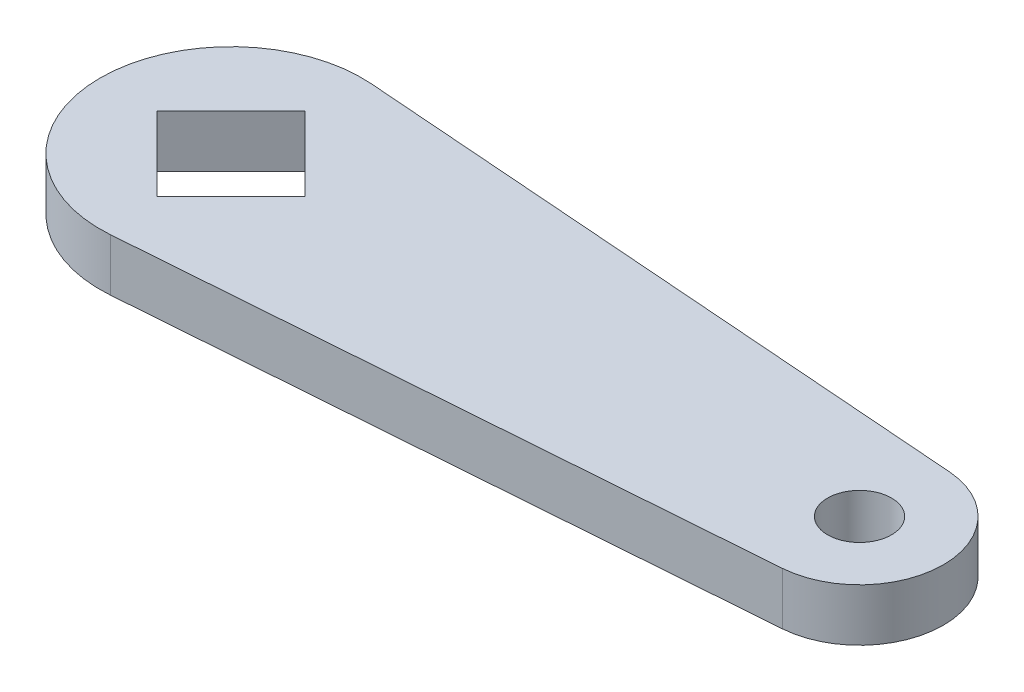
ISO-10303-21;
HEADER;
FILE_DESCRIPTION(('STEP AP214'),'2;1');
FILE_NAME('part.step','',(''),(''),'','','');
FILE_SCHEMA(('AUTOMOTIVE_DESIGN { 1 0 10303 214 1 1 1 1 }'));
ENDSEC;
DATA;
#1=APPLICATION_CONTEXT('core data for automotive mechanical design processes');
#2=APPLICATION_PROTOCOL_DEFINITION('international standard','automotive_design',2000,#1);
#3=PRODUCT_CONTEXT('',#1,'mechanical');
#4=PRODUCT('Part','Part','',(#3));
#5=PRODUCT_RELATED_PRODUCT_CATEGORY('part','',(#4));
#6=PRODUCT_DEFINITION_FORMATION('','',#4);
#7=PRODUCT_DEFINITION_CONTEXT('part definition',#1,'design');
#8=PRODUCT_DEFINITION('design','',#6,#7);
#9=PRODUCT_DEFINITION_SHAPE('','',#8);
#10=(LENGTH_UNIT() NAMED_UNIT(*) SI_UNIT(.MILLI.,.METRE.));
#11=(NAMED_UNIT(*) PLANE_ANGLE_UNIT() SI_UNIT($,.RADIAN.));
#12=(NAMED_UNIT(*) SI_UNIT($,.STERADIAN.) SOLID_ANGLE_UNIT());
#13=UNCERTAINTY_MEASURE_WITH_UNIT(LENGTH_MEASURE(1.E-05),#10,'distance_accuracy_value','');
#14=(GEOMETRIC_REPRESENTATION_CONTEXT(3) GLOBAL_UNCERTAINTY_ASSIGNED_CONTEXT((#13)) GLOBAL_UNIT_ASSIGNED_CONTEXT((#10,
#11,#12)) REPRESENTATION_CONTEXT('',''));
#15=CARTESIAN_POINT('',(0.,0.,0.));
#16=DIRECTION('',(0.,0.,1.));
#17=DIRECTION('',(1.,0.,0.));
#18=AXIS2_PLACEMENT_3D('',#15,#16,#17);
#19=CARTESIAN_POINT('',(3.53553390593274,5.,3.53553390593274));
#20=DIRECTION('',(-0.707106781186547,0.,-0.707106781186548));
#21=DIRECTION('',(-0.707106781186548,0.,0.707106781186547));
#22=AXIS2_PLACEMENT_3D('',#19,#20,#21);
#23=PLANE('',#22);
#24=DIRECTION('',(0.707106781186548,0.,-0.707106781186547));
#25=VECTOR('',#24,1.);
#26=CARTESIAN_POINT('',(3.53553390593274,0.,3.53553390593274));
#27=LINE('',#26,#25);
#28=CARTESIAN_POINT('',(0.,0.,7.07106781186547));
#29=VERTEX_POINT('',#28);
#30=CARTESIAN_POINT('',(7.07106781186548,0.,0.));
#31=VERTEX_POINT('',#30);
#32=EDGE_CURVE('E157',#29,#31,#27,.T.);
#33=ORIENTED_EDGE('',*,*,#32,.F.);
#34=DIRECTION('',(0.,-1.,0.));
#35=VECTOR('',#34,1.);
#36=CARTESIAN_POINT('',(0.,5.,7.07106781186547));
#37=LINE('',#36,#35);
#38=CARTESIAN_POINT('',(0.,5.,7.07106781186547));
#39=VERTEX_POINT('',#38);
#40=EDGE_CURVE('E11',#39,#29,#37,.T.);
#41=ORIENTED_EDGE('',*,*,#40,.F.);
#42=DIRECTION('',(0.707106781186548,0.,-0.707106781186547));
#43=VECTOR('',#42,1.);
#44=CARTESIAN_POINT('',(3.53553390593274,5.,3.53553390593274));
#45=LINE('',#44,#43);
#46=CARTESIAN_POINT('',(7.07106781186548,5.,0.));
#47=VERTEX_POINT('',#46);
#48=EDGE_CURVE('E135',#39,#47,#45,.T.);
#49=ORIENTED_EDGE('',*,*,#48,.T.);
#50=DIRECTION('',(0.,-1.,0.));
#51=VECTOR('',#50,1.);
#52=CARTESIAN_POINT('',(7.07106781186548,5.,0.));
#53=LINE('',#52,#51);
#54=EDGE_CURVE('E95',#47,#31,#53,.T.);
#55=ORIENTED_EDGE('',*,*,#54,.T.);
#56=EDGE_LOOP('',(#33,#41,#49,#55));
#57=FACE_BOUND('',#56,.T.);
#58=ADVANCED_FACE('F41',(#57),#23,.T.);
#59=CARTESIAN_POINT('',(-3.53553390593273,5.,3.53553390593273));
#60=DIRECTION('',(0.707106781186548,0.,-0.707106781186548));
#61=DIRECTION('',(-0.707106781186548,0.,-0.707106781186548));
#62=AXIS2_PLACEMENT_3D('',#59,#60,#61);
#63=PLANE('',#62);
#64=DIRECTION('',(0.707106781186548,0.,0.707106781186548));
#65=VECTOR('',#64,1.);
#66=CARTESIAN_POINT('',(-3.53553390593273,0.,3.53553390593273));
#67=LINE('',#66,#65);
#68=CARTESIAN_POINT('',(-7.07106781186547,0.,0.));
#69=VERTEX_POINT('',#68);
#70=EDGE_CURVE('E124',#69,#29,#67,.T.);
#71=ORIENTED_EDGE('',*,*,#70,.F.);
#72=DIRECTION('',(0.,-1.,0.));
#73=VECTOR('',#72,1.);
#74=CARTESIAN_POINT('',(-7.07106781186547,5.,0.));
#75=LINE('',#74,#73);
#76=CARTESIAN_POINT('',(-7.07106781186547,5.,0.));
#77=VERTEX_POINT('',#76);
#78=EDGE_CURVE('E51',#77,#69,#75,.T.);
#79=ORIENTED_EDGE('',*,*,#78,.F.);
#80=DIRECTION('',(0.707106781186548,0.,0.707106781186548));
#81=VECTOR('',#80,1.);
#82=CARTESIAN_POINT('',(-3.53553390593273,5.,3.53553390593273));
#83=LINE('',#82,#81);
#84=EDGE_CURVE('E122',#77,#39,#83,.T.);
#85=ORIENTED_EDGE('',*,*,#84,.T.);
#86=ORIENTED_EDGE('',*,*,#40,.T.);
#87=EDGE_LOOP('',(#71,#79,#85,#86));
#88=FACE_BOUND('',#87,.T.);
#89=ADVANCED_FACE('F120',(#88),#63,.T.);
#90=CARTESIAN_POINT('',(-3.53553390593274,5.,-3.53553390593274));
#91=DIRECTION('',(-0.707106781186547,0.,-0.707106781186548));
#92=DIRECTION('',(-0.707106781186548,0.,0.707106781186547));
#93=AXIS2_PLACEMENT_3D('',#90,#91,#92);
#94=PLANE('',#93);
#95=DIRECTION('',(0.707106781186548,0.,-0.707106781186547));
#96=VECTOR('',#95,1.);
#97=CARTESIAN_POINT('',(-3.53553390593274,0.,-3.53553390593274));
#98=LINE('',#97,#96);
#99=CARTESIAN_POINT('',(0.,0.,-7.07106781186548));
#100=VERTEX_POINT('',#99);
#101=EDGE_CURVE('E160',#69,#100,#98,.T.);
#102=ORIENTED_EDGE('',*,*,#101,.T.);
#103=DIRECTION('',(0.,-1.,0.));
#104=VECTOR('',#103,1.);
#105=CARTESIAN_POINT('',(0.,5.,-7.07106781186548));
#106=LINE('',#105,#104);
#107=CARTESIAN_POINT('',(0.,5.,-7.07106781186548));
#108=VERTEX_POINT('',#107);
#109=EDGE_CURVE('E127',#108,#100,#106,.T.);
#110=ORIENTED_EDGE('',*,*,#109,.F.);
#111=DIRECTION('',(0.707106781186548,0.,-0.707106781186547));
#112=VECTOR('',#111,1.);
#113=CARTESIAN_POINT('',(-3.53553390593274,5.,-3.53553390593274));
#114=LINE('',#113,#112);
#115=EDGE_CURVE('E130',#77,#108,#114,.T.);
#116=ORIENTED_EDGE('',*,*,#115,.F.);
#117=ORIENTED_EDGE('',*,*,#78,.T.);
#118=EDGE_LOOP('',(#102,#110,#116,#117));
#119=FACE_BOUND('',#118,.T.);
#120=ADVANCED_FACE('F131',(#119),#94,.F.);
#121=CARTESIAN_POINT('',(0.9375,5.,12.464794171987));
#122=DIRECTION('',(-0.075,0.,-0.997183533758957));
#123=DIRECTION('',(-0.997183533758957,0.,0.075));
#124=AXIS2_PLACEMENT_3D('',#121,#122,#123);
#125=PLANE('',#124);
#126=DIRECTION('',(0.997183533758957,0.,-0.075));
#127=VECTOR('',#126,1.);
#128=CARTESIAN_POINT('',(0.9375,0.,12.464794171987));
#129=LINE('',#128,#127);
#130=CARTESIAN_POINT('',(0.937500000000001,0.,12.464794171987));
#131=VERTEX_POINT('',#130);
#132=CARTESIAN_POINT('',(60.6,0.,7.97746827007165));
#133=VERTEX_POINT('',#132);
#134=EDGE_CURVE('E146',#131,#133,#129,.T.);
#135=ORIENTED_EDGE('',*,*,#134,.T.);
#136=DIRECTION('',(0.,-1.,0.));
#137=VECTOR('',#136,1.);
#138=CARTESIAN_POINT('',(60.6,5.,7.97746827007165));
#139=LINE('',#138,#137);
#140=CARTESIAN_POINT('',(60.6,5.,7.97746827007165));
#141=VERTEX_POINT('',#140);
#142=EDGE_CURVE('E45',#141,#133,#139,.T.);
#143=ORIENTED_EDGE('',*,*,#142,.F.);
#144=DIRECTION('',(0.997183533758957,0.,-0.075));
#145=VECTOR('',#144,1.);
#146=CARTESIAN_POINT('',(0.9375,5.,12.464794171987));
#147=LINE('',#146,#145);
#148=CARTESIAN_POINT('',(0.937500000000001,5.,12.464794171987));
#149=VERTEX_POINT('',#148);
#150=EDGE_CURVE('E166',#149,#141,#147,.T.);
#151=ORIENTED_EDGE('',*,*,#150,.F.);
#152=DIRECTION('',(0.,-1.,0.));
#153=VECTOR('',#152,1.);
#154=CARTESIAN_POINT('',(0.937500000000001,5.,12.464794171987));
#155=LINE('',#154,#153);
#156=EDGE_CURVE('E145',#149,#131,#155,.T.);
#157=ORIENTED_EDGE('',*,*,#156,.T.);
#158=EDGE_LOOP('',(#135,#143,#151,#157));
#159=FACE_BOUND('',#158,.T.);
#160=ADVANCED_FACE('F43',(#159),#125,.F.);
#161=CARTESIAN_POINT('',(60.,5.,0.));
#162=DIRECTION('',(0.,-1.,0.));
#163=DIRECTION('',(0.,0.,-1.));
#164=AXIS2_PLACEMENT_3D('',#161,#162,#163);
#165=CYLINDRICAL_SURFACE('',#164,8.);
#166=CARTESIAN_POINT('',(60.,0.,0.));
#167=DIRECTION('',(0.,1.,0.));
#168=DIRECTION('',(0.,0.,1.));
#169=AXIS2_PLACEMENT_3D('',#166,#167,#168);
#170=CIRCLE('',#169,8.);
#171=CARTESIAN_POINT('',(60.6,0.,-7.97746827007165));
#172=VERTEX_POINT('',#171);
#173=EDGE_CURVE('E149',#133,#172,#170,.T.);
#174=ORIENTED_EDGE('',*,*,#173,.T.);
#175=DIRECTION('',(0.,-1.,0.));
#176=VECTOR('',#175,1.);
#177=CARTESIAN_POINT('',(60.6,5.,-7.97746827007165));
#178=LINE('',#177,#176);
#179=CARTESIAN_POINT('',(60.6,5.,-7.97746827007165));
#180=VERTEX_POINT('',#179);
#181=EDGE_CURVE('E172',#180,#172,#178,.T.);
#182=ORIENTED_EDGE('',*,*,#181,.F.);
#183=CARTESIAN_POINT('',(60.,5.,0.));
#184=DIRECTION('',(0.,1.,0.));
#185=DIRECTION('',(0.,0.,1.));
#186=AXIS2_PLACEMENT_3D('',#183,#184,#185);
#187=CIRCLE('',#186,8.);
#188=EDGE_CURVE('E103',#141,#180,#187,.T.);
#189=ORIENTED_EDGE('',*,*,#188,.F.);
#190=ORIENTED_EDGE('',*,*,#142,.T.);
#191=EDGE_LOOP('',(#174,#182,#189,#190));
#192=FACE_BOUND('',#191,.T.);
#193=ADVANCED_FACE('F177',(#192),#165,.T.);
#194=CARTESIAN_POINT('',(0.937500000000002,5.,-12.464794171987));
#195=DIRECTION('',(0.0750000000000001,0.,-0.997183533758957));
#196=DIRECTION('',(-0.997183533758957,0.,-0.0750000000000001));
#197=AXIS2_PLACEMENT_3D('',#194,#195,#196);
#198=PLANE('',#197);
#199=DIRECTION('',(0.997183533758957,0.,0.0750000000000001));
#200=VECTOR('',#199,1.);
#201=CARTESIAN_POINT('',(0.937500000000002,0.,-12.464794171987));
#202=LINE('',#201,#200);
#203=CARTESIAN_POINT('',(0.937500000000001,0.,-12.464794171987));
#204=VERTEX_POINT('',#203);
#205=EDGE_CURVE('E152',#204,#172,#202,.T.);
#206=ORIENTED_EDGE('',*,*,#205,.F.);
#207=DIRECTION('',(0.,-1.,0.));
#208=VECTOR('',#207,1.);
#209=CARTESIAN_POINT('',(0.937500000000001,5.,-12.464794171987));
#210=LINE('',#209,#208);
#211=CARTESIAN_POINT('',(0.937500000000001,5.,-12.464794171987));
#212=VERTEX_POINT('',#211);
#213=EDGE_CURVE('E171',#212,#204,#210,.T.);
#214=ORIENTED_EDGE('',*,*,#213,.F.);
#215=DIRECTION('',(0.997183533758957,0.,0.0750000000000001));
#216=VECTOR('',#215,1.);
#217=CARTESIAN_POINT('',(0.937500000000002,5.,-12.464794171987));
#218=LINE('',#217,#216);
#219=EDGE_CURVE('E188',#212,#180,#218,.T.);
#220=ORIENTED_EDGE('',*,*,#219,.T.);
#221=ORIENTED_EDGE('',*,*,#181,.T.);
#222=EDGE_LOOP('',(#206,#214,#220,#221));
#223=FACE_BOUND('',#222,.T.);
#224=ADVANCED_FACE('F185',(#223),#198,.T.);
#225=CARTESIAN_POINT('',(3.53553390593274,5.,-3.53553390593274));
#226=DIRECTION('',(0.707106781186548,0.,-0.707106781186548));
#227=DIRECTION('',(-0.707106781186548,0.,-0.707106781186548));
#228=AXIS2_PLACEMENT_3D('',#225,#226,#227);
#229=PLANE('',#228);
#230=DIRECTION('',(0.707106781186548,0.,0.707106781186548));
#231=VECTOR('',#230,1.);
#232=CARTESIAN_POINT('',(3.53553390593274,0.,-3.53553390593274));
#233=LINE('',#232,#231);
#234=EDGE_CURVE('E88',#100,#31,#233,.T.);
#235=ORIENTED_EDGE('',*,*,#234,.T.);
#236=ORIENTED_EDGE('',*,*,#54,.F.);
#237=DIRECTION('',(0.707106781186548,0.,0.707106781186548));
#238=VECTOR('',#237,1.);
#239=CARTESIAN_POINT('',(3.53553390593274,5.,-3.53553390593274));
#240=LINE('',#239,#238);
#241=EDGE_CURVE('E60',#108,#47,#240,.T.);
#242=ORIENTED_EDGE('',*,*,#241,.F.);
#243=ORIENTED_EDGE('',*,*,#109,.T.);
#244=EDGE_LOOP('',(#235,#236,#242,#243));
#245=FACE_BOUND('',#244,.T.);
#246=ADVANCED_FACE('F215',(#245),#229,.F.);
#247=CARTESIAN_POINT('',(0.,5.,0.));
#248=DIRECTION('',(0.,-1.,0.));
#249=DIRECTION('',(0.,0.,-1.));
#250=AXIS2_PLACEMENT_3D('',#247,#248,#249);
#251=CYLINDRICAL_SURFACE('',#250,12.5);
#252=CARTESIAN_POINT('',(0.,0.,0.));
#253=DIRECTION('',(0.,1.,0.));
#254=DIRECTION('',(0.,0.,1.));
#255=AXIS2_PLACEMENT_3D('',#252,#253,#254);
#256=CIRCLE('',#255,12.5);
#257=EDGE_CURVE('E155',#204,#131,#256,.T.);
#258=ORIENTED_EDGE('',*,*,#257,.T.);
#259=ORIENTED_EDGE('',*,*,#156,.F.);
#260=CARTESIAN_POINT('',(0.,5.,0.));
#261=DIRECTION('',(0.,1.,0.));
#262=DIRECTION('',(0.,0.,1.));
#263=AXIS2_PLACEMENT_3D('',#260,#261,#262);
#264=CIRCLE('',#263,12.5);
#265=EDGE_CURVE('E137',#212,#149,#264,.T.);
#266=ORIENTED_EDGE('',*,*,#265,.F.);
#267=ORIENTED_EDGE('',*,*,#213,.T.);
#268=EDGE_LOOP('',(#258,#259,#266,#267));
#269=FACE_BOUND('',#268,.T.);
#270=ADVANCED_FACE('F190',(#269),#251,.T.);
#271=CARTESIAN_POINT('',(60.,5.,0.));
#272=DIRECTION('',(0.,-1.,0.));
#273=DIRECTION('',(0.,0.,-1.));
#274=AXIS2_PLACEMENT_3D('',#271,#272,#273);
#275=CYLINDRICAL_SURFACE('',#274,3.05000000000001);
#276=CARTESIAN_POINT('',(60.,5.,0.));
#277=DIRECTION('',(0.,1.,0.));
#278=DIRECTION('',(0.,0.,1.));
#279=AXIS2_PLACEMENT_3D('',#276,#277,#278);
#280=CIRCLE('',#279,3.05000000000001);
#281=CARTESIAN_POINT('',(60.,5.,3.05000000000001));
#282=VERTEX_POINT('',#281);
#283=EDGE_CURVE('E142',#282,#282,#280,.T.);
#284=ORIENTED_EDGE('',*,*,#283,.T.);
#285=EDGE_LOOP('',(#284));
#286=FACE_BOUND('',#285,.T.);
#287=CARTESIAN_POINT('',(60.,0.,0.));
#288=DIRECTION('',(0.,1.,0.));
#289=DIRECTION('',(0.,0.,1.));
#290=AXIS2_PLACEMENT_3D('',#287,#288,#289);
#291=CIRCLE('',#290,3.05000000000001);
#292=CARTESIAN_POINT('',(60.,0.,3.05000000000001));
#293=VERTEX_POINT('',#292);
#294=EDGE_CURVE('E163',#293,#293,#291,.T.);
#295=ORIENTED_EDGE('',*,*,#294,.F.);
#296=EDGE_LOOP('',(#295));
#297=FACE_BOUND('',#296,.T.);
#298=ADVANCED_FACE('F196',(#286,#297),#275,.F.);
#299=CARTESIAN_POINT('',(0.,5.,0.));
#300=DIRECTION('',(0.,1.,0.));
#301=DIRECTION('',(0.,0.,1.));
#302=AXIS2_PLACEMENT_3D('',#299,#300,#301);
#303=PLANE('',#302);
#304=ORIENTED_EDGE('',*,*,#150,.T.);
#305=ORIENTED_EDGE('',*,*,#188,.T.);
#306=ORIENTED_EDGE('',*,*,#219,.F.);
#307=ORIENTED_EDGE('',*,*,#265,.T.);
#308=EDGE_LOOP('',(#304,#305,#306,#307));
#309=FACE_BOUND('',#308,.T.);
#310=ORIENTED_EDGE('',*,*,#48,.F.);
#311=ORIENTED_EDGE('',*,*,#84,.F.);
#312=ORIENTED_EDGE('',*,*,#115,.T.);
#313=ORIENTED_EDGE('',*,*,#241,.T.);
#314=EDGE_LOOP('',(#310,#311,#312,#313));
#315=FACE_BOUND('',#314,.T.);
#316=ORIENTED_EDGE('',*,*,#283,.F.);
#317=EDGE_LOOP('',(#316));
#318=FACE_BOUND('',#317,.T.);
#319=ADVANCED_FACE('F133',(#309,#315,#318),#303,.T.);
#320=CARTESIAN_POINT('',(0.,0.,0.));
#321=DIRECTION('',(0.,1.,0.));
#322=DIRECTION('',(0.,0.,1.));
#323=AXIS2_PLACEMENT_3D('',#320,#321,#322);
#324=PLANE('',#323);
#325=ORIENTED_EDGE('',*,*,#134,.F.);
#326=ORIENTED_EDGE('',*,*,#257,.F.);
#327=ORIENTED_EDGE('',*,*,#205,.T.);
#328=ORIENTED_EDGE('',*,*,#173,.F.);
#329=EDGE_LOOP('',(#325,#326,#327,#328));
#330=FACE_BOUND('',#329,.T.);
#331=ORIENTED_EDGE('',*,*,#32,.T.);
#332=ORIENTED_EDGE('',*,*,#234,.F.);
#333=ORIENTED_EDGE('',*,*,#101,.F.);
#334=ORIENTED_EDGE('',*,*,#70,.T.);
#335=EDGE_LOOP('',(#331,#332,#333,#334));
#336=FACE_BOUND('',#335,.T.);
#337=ORIENTED_EDGE('',*,*,#294,.T.);
#338=EDGE_LOOP('',(#337));
#339=FACE_BOUND('',#338,.T.);
#340=ADVANCED_FACE('F184',(#330,#336,#339),#324,.F.);
#341=CLOSED_SHELL('',(#58,#89,#120,#160,#193,#224,#246,#270,#298,#319,#340));
#342=MANIFOLD_SOLID_BREP('B2',#341);
#343=ADVANCED_BREP_SHAPE_REPRESENTATION('',(#18,#342),#14);
#344=SHAPE_DEFINITION_REPRESENTATION(#9,#343);
ENDSEC;
END-ISO-10303-21;
